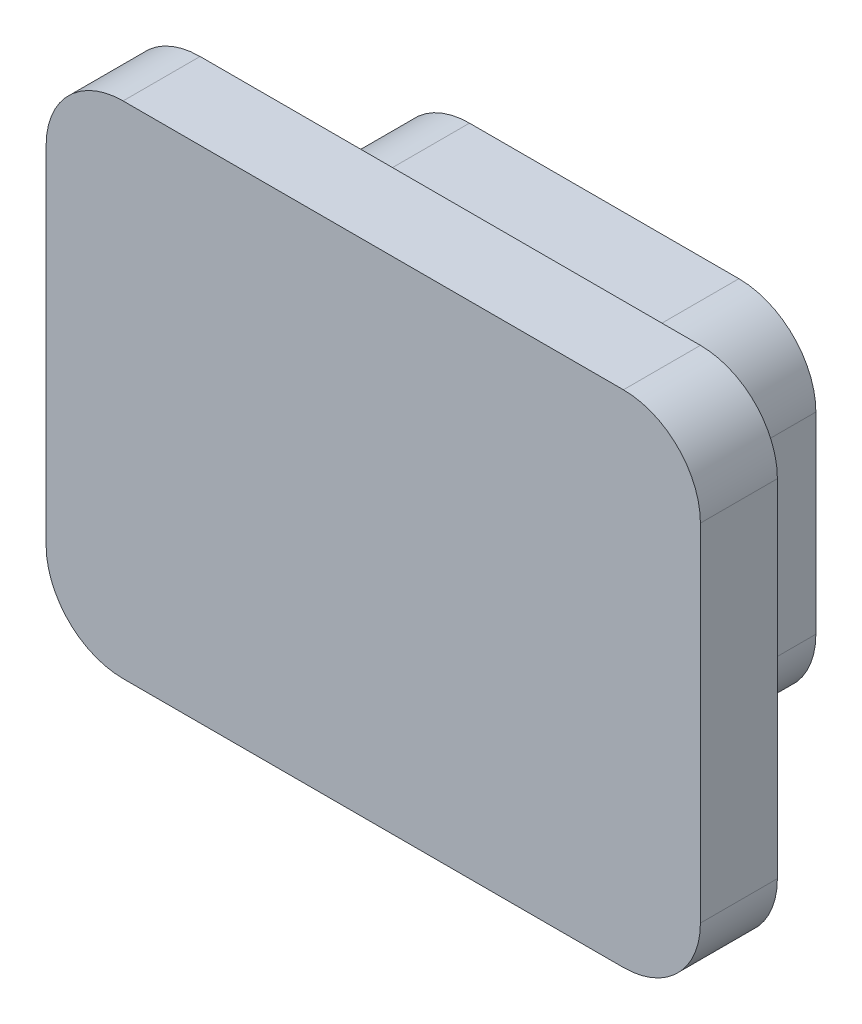
ISO-10303-21;
HEADER;
FILE_DESCRIPTION(('STEP AP214'),'2;1');
FILE_NAME('part.step','',(''),(''),'','','');
FILE_SCHEMA(('AUTOMOTIVE_DESIGN { 1 0 10303 214 1 1 1 1 }'));
ENDSEC;
DATA;
#1=APPLICATION_CONTEXT('core data for automotive mechanical design processes');
#2=APPLICATION_PROTOCOL_DEFINITION('international standard','automotive_design',2000,#1);
#3=PRODUCT_CONTEXT('',#1,'mechanical');
#4=PRODUCT('Part','Part','',(#3));
#5=PRODUCT_RELATED_PRODUCT_CATEGORY('part','',(#4));
#6=PRODUCT_DEFINITION_FORMATION('','',#4);
#7=PRODUCT_DEFINITION_CONTEXT('part definition',#1,'design');
#8=PRODUCT_DEFINITION('design','',#6,#7);
#9=PRODUCT_DEFINITION_SHAPE('','',#8);
#10=(LENGTH_UNIT() NAMED_UNIT(*) SI_UNIT(.MILLI.,.METRE.));
#11=(NAMED_UNIT(*) PLANE_ANGLE_UNIT() SI_UNIT($,.RADIAN.));
#12=(NAMED_UNIT(*) SI_UNIT($,.STERADIAN.) SOLID_ANGLE_UNIT());
#13=UNCERTAINTY_MEASURE_WITH_UNIT(LENGTH_MEASURE(1.E-05),#10,'distance_accuracy_value','');
#14=(GEOMETRIC_REPRESENTATION_CONTEXT(3) GLOBAL_UNCERTAINTY_ASSIGNED_CONTEXT((#13)) GLOBAL_UNIT_ASSIGNED_CONTEXT((#10,
#11,#12)) REPRESENTATION_CONTEXT('',''));
#15=CARTESIAN_POINT('',(0.,0.,0.));
#16=DIRECTION('',(0.,0.,1.));
#17=DIRECTION('',(1.,0.,0.));
#18=AXIS2_PLACEMENT_3D('',#15,#16,#17);
#19=CARTESIAN_POINT('',(1.75,-1.25,2.));
#20=DIRECTION('',(0.,0.,-1.));
#21=DIRECTION('',(-1.,0.,0.));
#22=AXIS2_PLACEMENT_3D('',#19,#20,#21);
#23=CYLINDRICAL_SURFACE('',#22,1.);
#24=CARTESIAN_POINT('',(1.75,-1.25,0.));
#25=DIRECTION('',(0.,0.,1.));
#26=DIRECTION('',(1.,0.,0.));
#27=AXIS2_PLACEMENT_3D('',#24,#25,#26);
#28=CIRCLE('',#27,1.);
#29=CARTESIAN_POINT('',(1.75,-2.25,0.));
#30=VERTEX_POINT('',#29);
#31=CARTESIAN_POINT('',(2.75,-1.25,0.));
#32=VERTEX_POINT('',#31);
#33=EDGE_CURVE('E154',#30,#32,#28,.T.);
#34=ORIENTED_EDGE('',*,*,#33,.T.);
#35=DIRECTION('',(0.,0.,-1.));
#36=VECTOR('',#35,1.);
#37=CARTESIAN_POINT('',(2.75,-1.25,2.));
#38=LINE('',#37,#36);
#39=CARTESIAN_POINT('',(2.75,-1.25,2.));
#40=VERTEX_POINT('',#39);
#41=EDGE_CURVE('E11',#40,#32,#38,.T.);
#42=ORIENTED_EDGE('',*,*,#41,.F.);
#43=CARTESIAN_POINT('',(1.75,-1.25,2.));
#44=DIRECTION('',(0.,0.,1.));
#45=DIRECTION('',(1.,0.,0.));
#46=AXIS2_PLACEMENT_3D('',#43,#44,#45);
#47=CIRCLE('',#46,1.);
#48=CARTESIAN_POINT('',(1.75,-2.25,2.));
#49=VERTEX_POINT('',#48);
#50=EDGE_CURVE('E177',#49,#40,#47,.T.);
#51=ORIENTED_EDGE('',*,*,#50,.F.);
#52=DIRECTION('',(0.,0.,-1.));
#53=VECTOR('',#52,1.);
#54=CARTESIAN_POINT('',(1.75,-2.25,2.));
#55=LINE('',#54,#53);
#56=EDGE_CURVE('E153',#49,#30,#55,.T.);
#57=ORIENTED_EDGE('',*,*,#56,.T.);
#58=EDGE_LOOP('',(#34,#42,#51,#57));
#59=FACE_BOUND('',#58,.T.);
#60=ADVANCED_FACE('F39',(#59),#23,.T.);
#61=CARTESIAN_POINT('',(2.75,-1.25,2.));
#62=DIRECTION('',(-1.,0.,0.));
#63=DIRECTION('',(0.,0.,1.));
#64=AXIS2_PLACEMENT_3D('',#61,#62,#63);
#65=PLANE('',#64);
#66=DIRECTION('',(0.,1.,0.));
#67=VECTOR('',#66,1.);
#68=CARTESIAN_POINT('',(2.75,-1.25,0.));
#69=LINE('',#68,#67);
#70=CARTESIAN_POINT('',(2.75,1.25,0.));
#71=VERTEX_POINT('',#70);
#72=EDGE_CURVE('E158',#32,#71,#69,.T.);
#73=ORIENTED_EDGE('',*,*,#72,.T.);
#74=DIRECTION('',(0.,0.,-1.));
#75=VECTOR('',#74,1.);
#76=CARTESIAN_POINT('',(2.75,1.25,2.));
#77=LINE('',#76,#75);
#78=CARTESIAN_POINT('',(2.75,1.25,2.));
#79=VERTEX_POINT('',#78);
#80=EDGE_CURVE('E48',#79,#71,#77,.T.);
#81=ORIENTED_EDGE('',*,*,#80,.F.);
#82=DIRECTION('',(0.,1.,0.));
#83=VECTOR('',#82,1.);
#84=CARTESIAN_POINT('',(2.75,-1.25,2.));
#85=LINE('',#84,#83);
#86=EDGE_CURVE('E98',#40,#79,#85,.T.);
#87=ORIENTED_EDGE('',*,*,#86,.F.);
#88=ORIENTED_EDGE('',*,*,#41,.T.);
#89=EDGE_LOOP('',(#73,#81,#87,#88));
#90=FACE_BOUND('',#89,.T.);
#91=ADVANCED_FACE('F356',(#90),#65,.F.);
#92=CARTESIAN_POINT('',(1.75,1.25,2.));
#93=DIRECTION('',(0.,0.,-1.));
#94=DIRECTION('',(-1.,0.,0.));
#95=AXIS2_PLACEMENT_3D('',#92,#93,#94);
#96=CYLINDRICAL_SURFACE('',#95,1.);
#97=CARTESIAN_POINT('',(1.75,1.25,0.));
#98=DIRECTION('',(0.,0.,1.));
#99=DIRECTION('',(1.,0.,0.));
#100=AXIS2_PLACEMENT_3D('',#97,#98,#99);
#101=CIRCLE('',#100,1.);
#102=CARTESIAN_POINT('',(1.75,2.25,0.));
#103=VERTEX_POINT('',#102);
#104=EDGE_CURVE('E162',#71,#103,#101,.T.);
#105=ORIENTED_EDGE('',*,*,#104,.T.);
#106=DIRECTION('',(0.,0.,-1.));
#107=VECTOR('',#106,1.);
#108=CARTESIAN_POINT('',(1.75,2.25,2.));
#109=LINE('',#108,#107);
#110=CARTESIAN_POINT('',(1.75,2.25,2.));
#111=VERTEX_POINT('',#110);
#112=EDGE_CURVE('E186',#111,#103,#109,.T.);
#113=ORIENTED_EDGE('',*,*,#112,.F.);
#114=CARTESIAN_POINT('',(1.75,1.25,2.));
#115=DIRECTION('',(0.,0.,1.));
#116=DIRECTION('',(1.,0.,0.));
#117=AXIS2_PLACEMENT_3D('',#114,#115,#116);
#118=CIRCLE('',#117,1.);
#119=EDGE_CURVE('E144',#79,#111,#118,.T.);
#120=ORIENTED_EDGE('',*,*,#119,.F.);
#121=ORIENTED_EDGE('',*,*,#80,.T.);
#122=EDGE_LOOP('',(#105,#113,#120,#121));
#123=FACE_BOUND('',#122,.T.);
#124=ADVANCED_FACE('F194',(#123),#96,.T.);
#125=CARTESIAN_POINT('',(-1.75,2.25,2.));
#126=DIRECTION('',(0.,-1.,0.));
#127=DIRECTION('',(0.,0.,-1.));
#128=AXIS2_PLACEMENT_3D('',#125,#126,#127);
#129=PLANE('',#128);
#130=DIRECTION('',(-1.,0.,0.));
#131=VECTOR('',#130,1.);
#132=CARTESIAN_POINT('',(-1.75,2.25,0.));
#133=LINE('',#132,#131);
#134=CARTESIAN_POINT('',(-1.75,2.25,0.));
#135=VERTEX_POINT('',#134);
#136=EDGE_CURVE('E165',#103,#135,#133,.T.);
#137=ORIENTED_EDGE('',*,*,#136,.T.);
#138=DIRECTION('',(0.,0.,-1.));
#139=VECTOR('',#138,1.);
#140=CARTESIAN_POINT('',(-1.75,2.25,2.));
#141=LINE('',#140,#139);
#142=CARTESIAN_POINT('',(-1.75,2.25,2.));
#143=VERTEX_POINT('',#142);
#144=EDGE_CURVE('E125',#143,#135,#141,.T.);
#145=ORIENTED_EDGE('',*,*,#144,.F.);
#146=DIRECTION('',(-1.,0.,0.));
#147=VECTOR('',#146,1.);
#148=CARTESIAN_POINT('',(-1.75,2.25,2.));
#149=LINE('',#148,#147);
#150=EDGE_CURVE('E140',#111,#143,#149,.T.);
#151=ORIENTED_EDGE('',*,*,#150,.F.);
#152=ORIENTED_EDGE('',*,*,#112,.T.);
#153=EDGE_LOOP('',(#137,#145,#151,#152));
#154=FACE_BOUND('',#153,.T.);
#155=ADVANCED_FACE('F200',(#154),#129,.F.);
#156=CARTESIAN_POINT('',(-1.75,1.25,2.));
#157=DIRECTION('',(0.,0.,-1.));
#158=DIRECTION('',(-1.,0.,0.));
#159=AXIS2_PLACEMENT_3D('',#156,#157,#158);
#160=CYLINDRICAL_SURFACE('',#159,1.);
#161=CARTESIAN_POINT('',(-1.75,1.25,0.));
#162=DIRECTION('',(0.,0.,1.));
#163=DIRECTION('',(-1.,0.,0.));
#164=AXIS2_PLACEMENT_3D('',#161,#162,#163);
#165=CIRCLE('',#164,1.);
#166=CARTESIAN_POINT('',(-2.75,1.25,0.));
#167=VERTEX_POINT('',#166);
#168=EDGE_CURVE('E121',#135,#167,#165,.T.);
#169=ORIENTED_EDGE('',*,*,#168,.T.);
#170=DIRECTION('',(0.,0.,-1.));
#171=VECTOR('',#170,1.);
#172=CARTESIAN_POINT('',(-2.75,1.25,2.));
#173=LINE('',#172,#171);
#174=CARTESIAN_POINT('',(-2.75,1.25,2.));
#175=VERTEX_POINT('',#174);
#176=EDGE_CURVE('E113',#175,#167,#173,.T.);
#177=ORIENTED_EDGE('',*,*,#176,.F.);
#178=CARTESIAN_POINT('',(-1.75,1.25,2.));
#179=DIRECTION('',(0.,0.,1.));
#180=DIRECTION('',(-1.,0.,0.));
#181=AXIS2_PLACEMENT_3D('',#178,#179,#180);
#182=CIRCLE('',#181,1.);
#183=EDGE_CURVE('E118',#143,#175,#182,.T.);
#184=ORIENTED_EDGE('',*,*,#183,.F.);
#185=ORIENTED_EDGE('',*,*,#144,.T.);
#186=EDGE_LOOP('',(#169,#177,#184,#185));
#187=FACE_BOUND('',#186,.T.);
#188=ADVANCED_FACE('F115',(#187),#160,.T.);
#189=CARTESIAN_POINT('',(-2.75,-1.25,2.));
#190=DIRECTION('',(1.,0.,0.));
#191=DIRECTION('',(0.,0.,-1.));
#192=AXIS2_PLACEMENT_3D('',#189,#190,#191);
#193=PLANE('',#192);
#194=DIRECTION('',(0.,-1.,0.));
#195=VECTOR('',#194,1.);
#196=CARTESIAN_POINT('',(-2.75,-1.25,0.));
#197=LINE('',#196,#195);
#198=CARTESIAN_POINT('',(-2.75,-1.25,0.));
#199=VERTEX_POINT('',#198);
#200=EDGE_CURVE('E170',#167,#199,#197,.T.);
#201=ORIENTED_EDGE('',*,*,#200,.T.);
#202=DIRECTION('',(0.,0.,-1.));
#203=VECTOR('',#202,1.);
#204=CARTESIAN_POINT('',(-2.75,-1.25,2.));
#205=LINE('',#204,#203);
#206=CARTESIAN_POINT('',(-2.75,-1.25,2.));
#207=VERTEX_POINT('',#206);
#208=EDGE_CURVE('E126',#207,#199,#205,.T.);
#209=ORIENTED_EDGE('',*,*,#208,.F.);
#210=DIRECTION('',(0.,-1.,0.));
#211=VECTOR('',#210,1.);
#212=CARTESIAN_POINT('',(-2.75,-1.25,2.));
#213=LINE('',#212,#211);
#214=EDGE_CURVE('E129',#175,#207,#213,.T.);
#215=ORIENTED_EDGE('',*,*,#214,.F.);
#216=ORIENTED_EDGE('',*,*,#176,.T.);
#217=EDGE_LOOP('',(#201,#209,#215,#216));
#218=FACE_BOUND('',#217,.T.);
#219=ADVANCED_FACE('F130',(#218),#193,.F.);
#220=CARTESIAN_POINT('',(-1.75,-1.25,2.));
#221=DIRECTION('',(0.,0.,-1.));
#222=DIRECTION('',(-1.,0.,0.));
#223=AXIS2_PLACEMENT_3D('',#220,#221,#222);
#224=CYLINDRICAL_SURFACE('',#223,1.);
#225=CARTESIAN_POINT('',(-1.75,-1.25,0.));
#226=DIRECTION('',(0.,0.,1.));
#227=DIRECTION('',(-1.,0.,0.));
#228=AXIS2_PLACEMENT_3D('',#225,#226,#227);
#229=CIRCLE('',#228,1.);
#230=CARTESIAN_POINT('',(-1.75,-2.25,0.));
#231=VERTEX_POINT('',#230);
#232=EDGE_CURVE('E84',#199,#231,#229,.T.);
#233=ORIENTED_EDGE('',*,*,#232,.T.);
#234=DIRECTION('',(0.,0.,-1.));
#235=VECTOR('',#234,1.);
#236=CARTESIAN_POINT('',(-1.75,-2.25,2.));
#237=LINE('',#236,#235);
#238=CARTESIAN_POINT('',(-1.75,-2.25,2.));
#239=VERTEX_POINT('',#238);
#240=EDGE_CURVE('E56',#239,#231,#237,.T.);
#241=ORIENTED_EDGE('',*,*,#240,.F.);
#242=CARTESIAN_POINT('',(-1.75,-1.25,2.));
#243=DIRECTION('',(0.,0.,1.));
#244=DIRECTION('',(-1.,0.,0.));
#245=AXIS2_PLACEMENT_3D('',#242,#243,#244);
#246=CIRCLE('',#245,1.);
#247=EDGE_CURVE('E134',#207,#239,#246,.T.);
#248=ORIENTED_EDGE('',*,*,#247,.F.);
#249=ORIENTED_EDGE('',*,*,#208,.T.);
#250=EDGE_LOOP('',(#233,#241,#248,#249));
#251=FACE_BOUND('',#250,.T.);
#252=ADVANCED_FACE('F362',(#251),#224,.T.);
#253=CARTESIAN_POINT('',(-1.75,-2.25,2.));
#254=DIRECTION('',(0.,1.,0.));
#255=DIRECTION('',(0.,0.,1.));
#256=AXIS2_PLACEMENT_3D('',#253,#254,#255);
#257=PLANE('',#256);
#258=DIRECTION('',(1.,0.,0.));
#259=VECTOR('',#258,1.);
#260=CARTESIAN_POINT('',(-1.75,-2.25,0.));
#261=LINE('',#260,#259);
#262=EDGE_CURVE('E90',#231,#30,#261,.T.);
#263=ORIENTED_EDGE('',*,*,#262,.T.);
#264=ORIENTED_EDGE('',*,*,#56,.F.);
#265=DIRECTION('',(1.,0.,0.));
#266=VECTOR('',#265,1.);
#267=CARTESIAN_POINT('',(-1.75,-2.25,2.));
#268=LINE('',#267,#266);
#269=EDGE_CURVE('E150',#239,#49,#268,.T.);
#270=ORIENTED_EDGE('',*,*,#269,.F.);
#271=ORIENTED_EDGE('',*,*,#240,.T.);
#272=EDGE_LOOP('',(#263,#264,#270,#271));
#273=FACE_BOUND('',#272,.T.);
#274=ADVANCED_FACE('F351',(#273),#257,.F.);
#275=CARTESIAN_POINT('',(1.75,-1.25,0.));
#276=DIRECTION('',(0.,0.,1.));
#277=DIRECTION('',(1.,0.,0.));
#278=AXIS2_PLACEMENT_3D('',#275,#276,#277);
#279=PLANE('',#278);
#280=ORIENTED_EDGE('',*,*,#33,.F.);
#281=ORIENTED_EDGE('',*,*,#262,.F.);
#282=ORIENTED_EDGE('',*,*,#232,.F.);
#283=ORIENTED_EDGE('',*,*,#200,.F.);
#284=ORIENTED_EDGE('',*,*,#168,.F.);
#285=ORIENTED_EDGE('',*,*,#136,.F.);
#286=ORIENTED_EDGE('',*,*,#104,.F.);
#287=ORIENTED_EDGE('',*,*,#72,.F.);
#288=EDGE_LOOP('',(#280,#281,#282,#283,#284,#285,#286,#287));
#289=FACE_BOUND('',#288,.T.);
#290=ADVANCED_FACE('F198',(#289),#279,.F.);
#291=CARTESIAN_POINT('',(-3.25,-2.25,2.));
#292=DIRECTION('',(0.,0.,1.));
#293=DIRECTION('',(1.,0.,0.));
#294=AXIS2_PLACEMENT_3D('',#291,#292,#293);
#295=PLANE('',#294);
#296=CARTESIAN_POINT('',(-3.25,-2.25,2.));
#297=DIRECTION('',(0.,0.,1.));
#298=DIRECTION('',(1.,0.,0.));
#299=AXIS2_PLACEMENT_3D('',#296,#297,#298);
#300=CIRCLE('',#299,1.);
#301=CARTESIAN_POINT('',(-4.25,-2.25,2.));
#302=VERTEX_POINT('',#301);
#303=CARTESIAN_POINT('',(-3.25,-3.25,2.));
#304=VERTEX_POINT('',#303);
#305=EDGE_CURVE('E269',#302,#304,#300,.T.);
#306=ORIENTED_EDGE('',*,*,#305,.F.);
#307=DIRECTION('',(0.,-1.,0.));
#308=VECTOR('',#307,1.);
#309=CARTESIAN_POINT('',(-4.25,-2.25,2.));
#310=LINE('',#309,#308);
#311=CARTESIAN_POINT('',(-4.25,2.25,2.));
#312=VERTEX_POINT('',#311);
#313=EDGE_CURVE('E240',#312,#302,#310,.T.);
#314=ORIENTED_EDGE('',*,*,#313,.F.);
#315=CARTESIAN_POINT('',(-3.25,2.25,2.));
#316=DIRECTION('',(0.,0.,1.));
#317=DIRECTION('',(-1.,0.,0.));
#318=AXIS2_PLACEMENT_3D('',#315,#316,#317);
#319=CIRCLE('',#318,1.);
#320=CARTESIAN_POINT('',(-3.25,3.25,2.));
#321=VERTEX_POINT('',#320);
#322=EDGE_CURVE('E245',#321,#312,#319,.T.);
#323=ORIENTED_EDGE('',*,*,#322,.F.);
#324=DIRECTION('',(-1.,0.,0.));
#325=VECTOR('',#324,1.);
#326=CARTESIAN_POINT('',(-3.25,3.25,2.));
#327=LINE('',#326,#325);
#328=CARTESIAN_POINT('',(3.25,3.25,2.));
#329=VERTEX_POINT('',#328);
#330=EDGE_CURVE('E249',#329,#321,#327,.T.);
#331=ORIENTED_EDGE('',*,*,#330,.F.);
#332=CARTESIAN_POINT('',(3.25,2.25,2.));
#333=DIRECTION('',(0.,0.,1.));
#334=DIRECTION('',(1.,0.,0.));
#335=AXIS2_PLACEMENT_3D('',#332,#333,#334);
#336=CIRCLE('',#335,1.);
#337=CARTESIAN_POINT('',(4.25,2.25,2.));
#338=VERTEX_POINT('',#337);
#339=EDGE_CURVE('E253',#338,#329,#336,.T.);
#340=ORIENTED_EDGE('',*,*,#339,.F.);
#341=DIRECTION('',(0.,1.,0.));
#342=VECTOR('',#341,1.);
#343=CARTESIAN_POINT('',(4.25,-2.25,2.));
#344=LINE('',#343,#342);
#345=CARTESIAN_POINT('',(4.25,-2.25,2.));
#346=VERTEX_POINT('',#345);
#347=EDGE_CURVE('E257',#346,#338,#344,.T.);
#348=ORIENTED_EDGE('',*,*,#347,.F.);
#349=CARTESIAN_POINT('',(3.25,-2.25,2.));
#350=DIRECTION('',(0.,0.,1.));
#351=DIRECTION('',(1.,0.,0.));
#352=AXIS2_PLACEMENT_3D('',#349,#350,#351);
#353=CIRCLE('',#352,1.);
#354=CARTESIAN_POINT('',(3.25,-3.25,2.));
#355=VERTEX_POINT('',#354);
#356=EDGE_CURVE('E261',#355,#346,#353,.T.);
#357=ORIENTED_EDGE('',*,*,#356,.F.);
#358=DIRECTION('',(1.,0.,0.));
#359=VECTOR('',#358,1.);
#360=CARTESIAN_POINT('',(-3.25,-3.25,2.));
#361=LINE('',#360,#359);
#362=EDGE_CURVE('E265',#304,#355,#361,.T.);
#363=ORIENTED_EDGE('',*,*,#362,.F.);
#364=EDGE_LOOP('',(#306,#314,#323,#331,#340,#348,#357,#363));
#365=FACE_BOUND('',#364,.T.);
#366=ORIENTED_EDGE('',*,*,#269,.T.);
#367=ORIENTED_EDGE('',*,*,#50,.T.);
#368=ORIENTED_EDGE('',*,*,#86,.T.);
#369=ORIENTED_EDGE('',*,*,#119,.T.);
#370=ORIENTED_EDGE('',*,*,#150,.T.);
#371=ORIENTED_EDGE('',*,*,#183,.T.);
#372=ORIENTED_EDGE('',*,*,#214,.T.);
#373=ORIENTED_EDGE('',*,*,#247,.T.);
#374=EDGE_LOOP('',(#366,#367,#368,#369,#370,#371,#372,#373));
#375=FACE_BOUND('',#374,.T.);
#376=ADVANCED_FACE('F137',(#365,#375),#295,.F.);
#377=CARTESIAN_POINT('',(-3.25,-2.25,3.));
#378=DIRECTION('',(0.,0.,-1.));
#379=DIRECTION('',(-1.,0.,0.));
#380=AXIS2_PLACEMENT_3D('',#377,#378,#379);
#381=CYLINDRICAL_SURFACE('',#380,1.);
#382=ORIENTED_EDGE('',*,*,#305,.T.);
#383=DIRECTION('',(0.,0.,-1.));
#384=VECTOR('',#383,1.);
#385=CARTESIAN_POINT('',(-3.25,-3.25,3.));
#386=LINE('',#385,#384);
#387=CARTESIAN_POINT('',(-3.25,-3.25,3.));
#388=VERTEX_POINT('',#387);
#389=EDGE_CURVE('E159',#388,#304,#386,.T.);
#390=ORIENTED_EDGE('',*,*,#389,.F.);
#391=CARTESIAN_POINT('',(-3.25,-2.25,3.));
#392=DIRECTION('',(0.,0.,1.));
#393=DIRECTION('',(1.,0.,0.));
#394=AXIS2_PLACEMENT_3D('',#391,#392,#393);
#395=CIRCLE('',#394,1.);
#396=CARTESIAN_POINT('',(-4.25,-2.25,3.));
#397=VERTEX_POINT('',#396);
#398=EDGE_CURVE('E244',#397,#388,#395,.T.);
#399=ORIENTED_EDGE('',*,*,#398,.F.);
#400=DIRECTION('',(0.,0.,-1.));
#401=VECTOR('',#400,1.);
#402=CARTESIAN_POINT('',(-4.25,-2.25,3.));
#403=LINE('',#402,#401);
#404=EDGE_CURVE('E235',#397,#302,#403,.T.);
#405=ORIENTED_EDGE('',*,*,#404,.T.);
#406=EDGE_LOOP('',(#382,#390,#399,#405));
#407=FACE_BOUND('',#406,.T.);
#408=ADVANCED_FACE('F316',(#407),#381,.T.);
#409=CARTESIAN_POINT('',(-3.25,-3.25,3.));
#410=DIRECTION('',(0.,1.,0.));
#411=DIRECTION('',(0.,0.,1.));
#412=AXIS2_PLACEMENT_3D('',#409,#410,#411);
#413=PLANE('',#412);
#414=ORIENTED_EDGE('',*,*,#362,.T.);
#415=DIRECTION('',(0.,0.,-1.));
#416=VECTOR('',#415,1.);
#417=CARTESIAN_POINT('',(3.25,-3.25,3.));
#418=LINE('',#417,#416);
#419=CARTESIAN_POINT('',(3.25,-3.25,3.));
#420=VERTEX_POINT('',#419);
#421=EDGE_CURVE('E211',#420,#355,#418,.T.);
#422=ORIENTED_EDGE('',*,*,#421,.F.);
#423=DIRECTION('',(1.,0.,0.));
#424=VECTOR('',#423,1.);
#425=CARTESIAN_POINT('',(-3.25,-3.25,3.));
#426=LINE('',#425,#424);
#427=EDGE_CURVE('E296',#388,#420,#426,.T.);
#428=ORIENTED_EDGE('',*,*,#427,.F.);
#429=ORIENTED_EDGE('',*,*,#389,.T.);
#430=EDGE_LOOP('',(#414,#422,#428,#429));
#431=FACE_BOUND('',#430,.T.);
#432=ADVANCED_FACE('F320',(#431),#413,.F.);
#433=CARTESIAN_POINT('',(3.25,-2.25,3.));
#434=DIRECTION('',(0.,0.,-1.));
#435=DIRECTION('',(-1.,0.,0.));
#436=AXIS2_PLACEMENT_3D('',#433,#434,#435);
#437=CYLINDRICAL_SURFACE('',#436,1.);
#438=ORIENTED_EDGE('',*,*,#356,.T.);
#439=DIRECTION('',(0.,0.,-1.));
#440=VECTOR('',#439,1.);
#441=CARTESIAN_POINT('',(4.25,-2.25,3.));
#442=LINE('',#441,#440);
#443=CARTESIAN_POINT('',(4.25,-2.25,3.));
#444=VERTEX_POINT('',#443);
#445=EDGE_CURVE('E215',#444,#346,#442,.T.);
#446=ORIENTED_EDGE('',*,*,#445,.F.);
#447=CARTESIAN_POINT('',(3.25,-2.25,3.));
#448=DIRECTION('',(0.,0.,1.));
#449=DIRECTION('',(1.,0.,0.));
#450=AXIS2_PLACEMENT_3D('',#447,#448,#449);
#451=CIRCLE('',#450,1.);
#452=EDGE_CURVE('E292',#420,#444,#451,.T.);
#453=ORIENTED_EDGE('',*,*,#452,.F.);
#454=ORIENTED_EDGE('',*,*,#421,.T.);
#455=EDGE_LOOP('',(#438,#446,#453,#454));
#456=FACE_BOUND('',#455,.T.);
#457=ADVANCED_FACE('F421',(#456),#437,.T.);
#458=CARTESIAN_POINT('',(4.25,-2.25,3.));
#459=DIRECTION('',(-1.,0.,0.));
#460=DIRECTION('',(0.,0.,1.));
#461=AXIS2_PLACEMENT_3D('',#458,#459,#460);
#462=PLANE('',#461);
#463=ORIENTED_EDGE('',*,*,#347,.T.);
#464=DIRECTION('',(0.,0.,-1.));
#465=VECTOR('',#464,1.);
#466=CARTESIAN_POINT('',(4.25,2.25,3.));
#467=LINE('',#466,#465);
#468=CARTESIAN_POINT('',(4.25,2.25,3.));
#469=VERTEX_POINT('',#468);
#470=EDGE_CURVE('E219',#469,#338,#467,.T.);
#471=ORIENTED_EDGE('',*,*,#470,.F.);
#472=DIRECTION('',(0.,1.,0.));
#473=VECTOR('',#472,1.);
#474=CARTESIAN_POINT('',(4.25,-2.25,3.));
#475=LINE('',#474,#473);
#476=EDGE_CURVE('E288',#444,#469,#475,.T.);
#477=ORIENTED_EDGE('',*,*,#476,.F.);
#478=ORIENTED_EDGE('',*,*,#445,.T.);
#479=EDGE_LOOP('',(#463,#471,#477,#478));
#480=FACE_BOUND('',#479,.T.);
#481=ADVANCED_FACE('F430',(#480),#462,.F.);
#482=CARTESIAN_POINT('',(3.25,2.25,3.));
#483=DIRECTION('',(0.,0.,-1.));
#484=DIRECTION('',(-1.,0.,0.));
#485=AXIS2_PLACEMENT_3D('',#482,#483,#484);
#486=CYLINDRICAL_SURFACE('',#485,1.);
#487=ORIENTED_EDGE('',*,*,#339,.T.);
#488=DIRECTION('',(0.,0.,-1.));
#489=VECTOR('',#488,1.);
#490=CARTESIAN_POINT('',(3.25,3.25,3.));
#491=LINE('',#490,#489);
#492=CARTESIAN_POINT('',(3.25,3.25,3.));
#493=VERTEX_POINT('',#492);
#494=EDGE_CURVE('E223',#493,#329,#491,.T.);
#495=ORIENTED_EDGE('',*,*,#494,.F.);
#496=CARTESIAN_POINT('',(3.25,2.25,3.));
#497=DIRECTION('',(0.,0.,1.));
#498=DIRECTION('',(1.,0.,0.));
#499=AXIS2_PLACEMENT_3D('',#496,#497,#498);
#500=CIRCLE('',#499,1.);
#501=EDGE_CURVE('E284',#469,#493,#500,.T.);
#502=ORIENTED_EDGE('',*,*,#501,.F.);
#503=ORIENTED_EDGE('',*,*,#470,.T.);
#504=EDGE_LOOP('',(#487,#495,#502,#503));
#505=FACE_BOUND('',#504,.T.);
#506=ADVANCED_FACE('F440',(#505),#486,.T.);
#507=CARTESIAN_POINT('',(-3.25,3.25,3.));
#508=DIRECTION('',(0.,-1.,0.));
#509=DIRECTION('',(0.,0.,-1.));
#510=AXIS2_PLACEMENT_3D('',#507,#508,#509);
#511=PLANE('',#510);
#512=ORIENTED_EDGE('',*,*,#330,.T.);
#513=DIRECTION('',(0.,0.,-1.));
#514=VECTOR('',#513,1.);
#515=CARTESIAN_POINT('',(-3.25,3.25,3.));
#516=LINE('',#515,#514);
#517=CARTESIAN_POINT('',(-3.25,3.25,3.));
#518=VERTEX_POINT('',#517);
#519=EDGE_CURVE('E227',#518,#321,#516,.T.);
#520=ORIENTED_EDGE('',*,*,#519,.F.);
#521=DIRECTION('',(-1.,0.,0.));
#522=VECTOR('',#521,1.);
#523=CARTESIAN_POINT('',(-3.25,3.25,3.));
#524=LINE('',#523,#522);
#525=EDGE_CURVE('E280',#493,#518,#524,.T.);
#526=ORIENTED_EDGE('',*,*,#525,.F.);
#527=ORIENTED_EDGE('',*,*,#494,.T.);
#528=EDGE_LOOP('',(#512,#520,#526,#527));
#529=FACE_BOUND('',#528,.T.);
#530=ADVANCED_FACE('F450',(#529),#511,.F.);
#531=CARTESIAN_POINT('',(-3.25,2.25,3.));
#532=DIRECTION('',(0.,0.,-1.));
#533=DIRECTION('',(-1.,0.,0.));
#534=AXIS2_PLACEMENT_3D('',#531,#532,#533);
#535=CYLINDRICAL_SURFACE('',#534,1.);
#536=ORIENTED_EDGE('',*,*,#322,.T.);
#537=DIRECTION('',(0.,0.,-1.));
#538=VECTOR('',#537,1.);
#539=CARTESIAN_POINT('',(-4.25,2.25,3.));
#540=LINE('',#539,#538);
#541=CARTESIAN_POINT('',(-4.25,2.25,3.));
#542=VERTEX_POINT('',#541);
#543=EDGE_CURVE('E231',#542,#312,#540,.T.);
#544=ORIENTED_EDGE('',*,*,#543,.F.);
#545=CARTESIAN_POINT('',(-3.25,2.25,3.));
#546=DIRECTION('',(0.,0.,1.));
#547=DIRECTION('',(-1.,0.,0.));
#548=AXIS2_PLACEMENT_3D('',#545,#546,#547);
#549=CIRCLE('',#548,1.);
#550=EDGE_CURVE('E276',#518,#542,#549,.T.);
#551=ORIENTED_EDGE('',*,*,#550,.F.);
#552=ORIENTED_EDGE('',*,*,#519,.T.);
#553=EDGE_LOOP('',(#536,#544,#551,#552));
#554=FACE_BOUND('',#553,.T.);
#555=ADVANCED_FACE('F460',(#554),#535,.T.);
#556=CARTESIAN_POINT('',(-4.25,-2.25,3.));
#557=DIRECTION('',(1.,0.,0.));
#558=DIRECTION('',(0.,0.,-1.));
#559=AXIS2_PLACEMENT_3D('',#556,#557,#558);
#560=PLANE('',#559);
#561=ORIENTED_EDGE('',*,*,#313,.T.);
#562=ORIENTED_EDGE('',*,*,#404,.F.);
#563=DIRECTION('',(0.,-1.,0.));
#564=VECTOR('',#563,1.);
#565=CARTESIAN_POINT('',(-4.25,-2.25,3.));
#566=LINE('',#565,#564);
#567=EDGE_CURVE('E239',#542,#397,#566,.T.);
#568=ORIENTED_EDGE('',*,*,#567,.F.);
#569=ORIENTED_EDGE('',*,*,#543,.T.);
#570=EDGE_LOOP('',(#561,#562,#568,#569));
#571=FACE_BOUND('',#570,.T.);
#572=ADVANCED_FACE('F341',(#571),#560,.F.);
#573=CARTESIAN_POINT('',(-3.25,-2.25,3.));
#574=DIRECTION('',(0.,0.,1.));
#575=DIRECTION('',(1.,0.,0.));
#576=AXIS2_PLACEMENT_3D('',#573,#574,#575);
#577=PLANE('',#576);
#578=ORIENTED_EDGE('',*,*,#398,.T.);
#579=ORIENTED_EDGE('',*,*,#427,.T.);
#580=ORIENTED_EDGE('',*,*,#452,.T.);
#581=ORIENTED_EDGE('',*,*,#476,.T.);
#582=ORIENTED_EDGE('',*,*,#501,.T.);
#583=ORIENTED_EDGE('',*,*,#525,.T.);
#584=ORIENTED_EDGE('',*,*,#550,.T.);
#585=ORIENTED_EDGE('',*,*,#567,.T.);
#586=EDGE_LOOP('',(#578,#579,#580,#581,#582,#583,#584,#585));
#587=FACE_BOUND('',#586,.T.);
#588=ADVANCED_FACE('F306',(#587),#577,.T.);
#589=CLOSED_SHELL('',(#60,#91,#124,#155,#188,#219,#252,#274,#290,#376,#408,#432,#457,#481,#506,
#530,#555,#572,#588));
#590=MANIFOLD_SOLID_BREP('B2',#589);
#591=ADVANCED_BREP_SHAPE_REPRESENTATION('',(#18,#590),#14);
#592=SHAPE_DEFINITION_REPRESENTATION(#9,#591);
ENDSEC;
END-ISO-10303-21;
